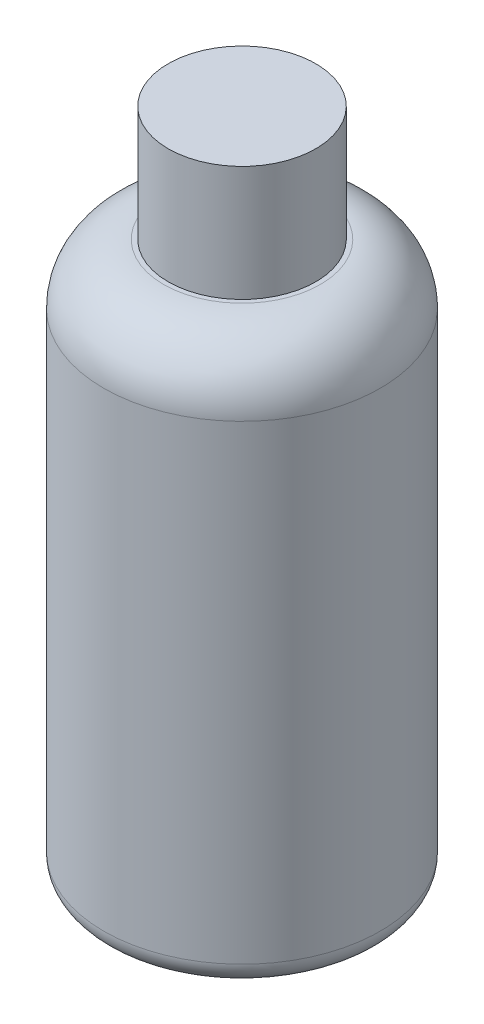
ISO-10303-21;
HEADER;
FILE_DESCRIPTION(('STEP AP214'),'2;1');
FILE_NAME('part.step','',(''),(''),'','','');
FILE_SCHEMA(('AUTOMOTIVE_DESIGN { 1 0 10303 214 1 1 1 1 }'));
ENDSEC;
DATA;
#1=APPLICATION_CONTEXT('core data for automotive mechanical design processes');
#2=APPLICATION_PROTOCOL_DEFINITION('international standard','automotive_design',2000,#1);
#3=PRODUCT_CONTEXT('',#1,'mechanical');
#4=PRODUCT('Part','Part','',(#3));
#5=PRODUCT_RELATED_PRODUCT_CATEGORY('part','',(#4));
#6=PRODUCT_DEFINITION_FORMATION('','',#4);
#7=PRODUCT_DEFINITION_CONTEXT('part definition',#1,'design');
#8=PRODUCT_DEFINITION('design','',#6,#7);
#9=PRODUCT_DEFINITION_SHAPE('','',#8);
#10=(LENGTH_UNIT() NAMED_UNIT(*) SI_UNIT(.MILLI.,.METRE.));
#11=(NAMED_UNIT(*) PLANE_ANGLE_UNIT() SI_UNIT($,.RADIAN.));
#12=(NAMED_UNIT(*) SI_UNIT($,.STERADIAN.) SOLID_ANGLE_UNIT());
#13=UNCERTAINTY_MEASURE_WITH_UNIT(LENGTH_MEASURE(1.E-05),#10,'distance_accuracy_value','');
#14=(GEOMETRIC_REPRESENTATION_CONTEXT(3) GLOBAL_UNCERTAINTY_ASSIGNED_CONTEXT((#13)) GLOBAL_UNIT_ASSIGNED_CONTEXT((#10,
#11,#12)) REPRESENTATION_CONTEXT('',''));
#15=CARTESIAN_POINT('',(0.,0.,0.));
#16=DIRECTION('',(0.,0.,1.));
#17=DIRECTION('',(1.,0.,0.));
#18=AXIS2_PLACEMENT_3D('',#15,#16,#17);
#19=CARTESIAN_POINT('',(0.,120.,17.));
#20=DIRECTION('',(0.,1.,0.));
#21=DIRECTION('',(0.,0.,1.));
#22=AXIS2_PLACEMENT_3D('',#19,#20,#21);
#23=PLANE('',#22);
#24=CARTESIAN_POINT('',(0.,120.,0.));
#25=DIRECTION('',(0.,1.,0.));
#26=DIRECTION('',(0.,0.,1.));
#27=AXIS2_PLACEMENT_3D('',#24,#25,#26);
#28=CIRCLE('',#27,15.);
#29=CARTESIAN_POINT('',(0.,120.,15.));
#30=VERTEX_POINT('',#29);
#31=EDGE_CURVE('E69',#30,#30,#28,.T.);
#32=ORIENTED_EDGE('',*,*,#31,.F.);
#33=EDGE_LOOP('',(#32));
#34=FACE_BOUND('',#33,.T.);
#35=CARTESIAN_POINT('',(0.,120.,0.));
#36=DIRECTION('',(0.,1.,0.));
#37=DIRECTION('',(0.,0.,1.));
#38=AXIS2_PLACEMENT_3D('',#35,#36,#37);
#39=CIRCLE('',#38,17.);
#40=CARTESIAN_POINT('',(0.,120.,17.));
#41=VERTEX_POINT('',#40);
#42=EDGE_CURVE('E77',#41,#41,#39,.T.);
#43=ORIENTED_EDGE('',*,*,#42,.T.);
#44=EDGE_LOOP('',(#43));
#45=FACE_BOUND('',#44,.T.);
#46=ADVANCED_FACE('F48',(#34,#45),#23,.T.);
#47=CARTESIAN_POINT('',(0.,0.,0.));
#48=DIRECTION('',(0.,1.,0.));
#49=DIRECTION('',(0.,0.,1.));
#50=AXIS2_PLACEMENT_3D('',#47,#48,#49);
#51=PLANE('',#50);
#52=CARTESIAN_POINT('',(0.,0.,0.));
#53=DIRECTION('',(0.,1.,0.));
#54=DIRECTION('',(0.,0.,1.));
#55=AXIS2_PLACEMENT_3D('',#52,#53,#54);
#56=CIRCLE('',#55,25.);
#57=CARTESIAN_POINT('',(0.,0.,25.));
#58=VERTEX_POINT('',#57);
#59=EDGE_CURVE('E59',#58,#58,#56,.F.);
#60=ORIENTED_EDGE('',*,*,#59,.T.);
#61=EDGE_LOOP('',(#60));
#62=FACE_BOUND('',#61,.T.);
#63=ADVANCED_FACE('F97',(#62),#51,.F.);
#64=CARTESIAN_POINT('',(0.,120.,0.));
#65=DIRECTION('',(0.,-1.,0.));
#66=DIRECTION('',(0.,0.,-1.));
#67=AXIS2_PLACEMENT_3D('',#64,#65,#66);
#68=CYLINDRICAL_SURFACE('',#67,30.);
#69=CARTESIAN_POINT('',(0.,5.,0.));
#70=DIRECTION('',(0.,1.,0.));
#71=DIRECTION('',(0.,0.,1.));
#72=AXIS2_PLACEMENT_3D('',#69,#70,#71);
#73=CIRCLE('',#72,30.);
#74=CARTESIAN_POINT('',(0.,5.,30.));
#75=VERTEX_POINT('',#74);
#76=EDGE_CURVE('E63',#75,#75,#73,.T.);
#77=ORIENTED_EDGE('',*,*,#76,.T.);
#78=EDGE_LOOP('',(#77));
#79=FACE_BOUND('',#78,.T.);
#80=CARTESIAN_POINT('',(0.,107.,0.));
#81=DIRECTION('',(0.,1.,0.));
#82=DIRECTION('',(0.,0.,1.));
#83=AXIS2_PLACEMENT_3D('',#80,#81,#82);
#84=CIRCLE('',#83,30.);
#85=CARTESIAN_POINT('',(0.,107.,30.));
#86=VERTEX_POINT('',#85);
#87=EDGE_CURVE('E72',#86,#86,#84,.F.);
#88=ORIENTED_EDGE('',*,*,#87,.T.);
#89=EDGE_LOOP('',(#88));
#90=FACE_BOUND('',#89,.T.);
#91=ADVANCED_FACE('F87',(#79,#90),#68,.T.);
#92=CARTESIAN_POINT('',(0.,107.,0.));
#93=DIRECTION('',(0.,1.,0.));
#94=DIRECTION('',(0.,0.,1.));
#95=AXIS2_PLACEMENT_3D('',#92,#93,#94);
#96=TOROIDAL_SURFACE('',#95,17.,13.);
#97=ORIENTED_EDGE('',*,*,#87,.F.);
#98=EDGE_LOOP('',(#97));
#99=FACE_BOUND('',#98,.T.);
#100=ORIENTED_EDGE('',*,*,#42,.F.);
#101=EDGE_LOOP('',(#100));
#102=FACE_BOUND('',#101,.T.);
#103=ADVANCED_FACE('F89',(#99,#102),#96,.T.);
#104=CARTESIAN_POINT('',(0.,1.,0.));
#105=DIRECTION('',(0.,-1.,0.));
#106=DIRECTION('',(0.,0.,-1.));
#107=AXIS2_PLACEMENT_3D('',#104,#105,#106);
#108=PLANE('',#107);
#109=CARTESIAN_POINT('',(0.,1.,0.));
#110=DIRECTION('',(0.,-1.,0.));
#111=DIRECTION('',(0.,0.,-1.));
#112=AXIS2_PLACEMENT_3D('',#109,#110,#111);
#113=CIRCLE('',#112,24.);
#114=CARTESIAN_POINT('',(0.,1.,-24.));
#115=VERTEX_POINT('',#114);
#116=EDGE_CURVE('E12',#115,#115,#113,.F.);
#117=ORIENTED_EDGE('',*,*,#116,.T.);
#118=EDGE_LOOP('',(#117));
#119=FACE_BOUND('',#118,.T.);
#120=ADVANCED_FACE('F92',(#119),#108,.F.);
#121=CARTESIAN_POINT('',(0.,120.,0.));
#122=DIRECTION('',(0.,-1.,0.));
#123=DIRECTION('',(0.,0.,-1.));
#124=AXIS2_PLACEMENT_3D('',#121,#122,#123);
#125=CYLINDRICAL_SURFACE('',#124,29.);
#126=CARTESIAN_POINT('',(0.,6.00000000000001,0.));
#127=DIRECTION('',(0.,-1.,0.));
#128=DIRECTION('',(0.,0.,-1.));
#129=AXIS2_PLACEMENT_3D('',#126,#127,#128);
#130=CIRCLE('',#129,29.);
#131=CARTESIAN_POINT('',(0.,6.00000000000001,-29.));
#132=VERTEX_POINT('',#131);
#133=EDGE_CURVE('E55',#132,#132,#130,.T.);
#134=ORIENTED_EDGE('',*,*,#133,.T.);
#135=EDGE_LOOP('',(#134));
#136=FACE_BOUND('',#135,.T.);
#137=CARTESIAN_POINT('',(0.,107.,0.));
#138=DIRECTION('',(0.,-1.,0.));
#139=DIRECTION('',(0.,0.,-1.));
#140=AXIS2_PLACEMENT_3D('',#137,#138,#139);
#141=CIRCLE('',#140,29.);
#142=CARTESIAN_POINT('',(0.,107.,-29.));
#143=VERTEX_POINT('',#142);
#144=EDGE_CURVE('E73',#143,#143,#141,.T.);
#145=ORIENTED_EDGE('',*,*,#144,.F.);
#146=EDGE_LOOP('',(#145));
#147=FACE_BOUND('',#146,.T.);
#148=ADVANCED_FACE('F127',(#136,#147),#125,.F.);
#149=CARTESIAN_POINT('',(0.,107.,0.));
#150=DIRECTION('',(0.,1.,0.));
#151=DIRECTION('',(0.,0.,1.));
#152=AXIS2_PLACEMENT_3D('',#149,#150,#151);
#153=TOROIDAL_SURFACE('',#152,17.,12.);
#154=ORIENTED_EDGE('',*,*,#144,.T.);
#155=EDGE_LOOP('',(#154));
#156=FACE_BOUND('',#155,.T.);
#157=CARTESIAN_POINT('',(0.,119.,0.));
#158=DIRECTION('',(0.,1.,0.));
#159=DIRECTION('',(0.,0.,1.));
#160=AXIS2_PLACEMENT_3D('',#157,#158,#159);
#161=CIRCLE('',#160,17.);
#162=CARTESIAN_POINT('',(0.,119.,17.));
#163=VERTEX_POINT('',#162);
#164=EDGE_CURVE('E76',#163,#163,#161,.T.);
#165=ORIENTED_EDGE('',*,*,#164,.T.);
#166=EDGE_LOOP('',(#165));
#167=FACE_BOUND('',#166,.T.);
#168=ADVANCED_FACE('F118',(#156,#167),#153,.F.);
#169=CARTESIAN_POINT('',(0.,119.,0.));
#170=DIRECTION('',(0.,1.,0.));
#171=DIRECTION('',(0.,0.,1.));
#172=AXIS2_PLACEMENT_3D('',#169,#170,#171);
#173=PLANE('',#172);
#174=ORIENTED_EDGE('',*,*,#164,.F.);
#175=EDGE_LOOP('',(#174));
#176=FACE_BOUND('',#175,.T.);
#177=CARTESIAN_POINT('',(0.,119.,0.));
#178=DIRECTION('',(0.,1.,0.));
#179=DIRECTION('',(0.,0.,1.));
#180=AXIS2_PLACEMENT_3D('',#177,#178,#179);
#181=CIRCLE('',#180,15.);
#182=CARTESIAN_POINT('',(0.,119.,15.));
#183=VERTEX_POINT('',#182);
#184=EDGE_CURVE('E68',#183,#183,#181,.T.);
#185=ORIENTED_EDGE('',*,*,#184,.T.);
#186=EDGE_LOOP('',(#185));
#187=FACE_BOUND('',#186,.T.);
#188=ADVANCED_FACE('F113',(#176,#187),#173,.F.);
#189=CARTESIAN_POINT('',(0.,145.,0.));
#190=DIRECTION('',(0.,-1.,0.));
#191=DIRECTION('',(0.,0.,-1.));
#192=AXIS2_PLACEMENT_3D('',#189,#190,#191);
#193=CYLINDRICAL_SURFACE('',#192,15.);
#194=ORIENTED_EDGE('',*,*,#184,.F.);
#195=EDGE_LOOP('',(#194));
#196=FACE_BOUND('',#195,.T.);
#197=ORIENTED_EDGE('',*,*,#31,.T.);
#198=EDGE_LOOP('',(#197));
#199=FACE_BOUND('',#198,.T.);
#200=ADVANCED_FACE('F101',(#196,#199),#193,.F.);
#201=CARTESIAN_POINT('',(0.,5.,0.));
#202=DIRECTION('',(0.,1.,0.));
#203=DIRECTION('',(0.,0.,1.));
#204=AXIS2_PLACEMENT_3D('',#201,#202,#203);
#205=TOROIDAL_SURFACE('',#204,25.,5.);
#206=ORIENTED_EDGE('',*,*,#59,.F.);
#207=EDGE_LOOP('',(#206));
#208=FACE_BOUND('',#207,.T.);
#209=ORIENTED_EDGE('',*,*,#76,.F.);
#210=EDGE_LOOP('',(#209));
#211=FACE_BOUND('',#210,.T.);
#212=ADVANCED_FACE('F100',(#208,#211),#205,.T.);
#213=CARTESIAN_POINT('',(0.,6.00000000000001,0.));
#214=DIRECTION('',(0.,-1.,0.));
#215=DIRECTION('',(0.,0.,-1.));
#216=AXIS2_PLACEMENT_3D('',#213,#214,#215);
#217=TOROIDAL_SURFACE('',#216,24.,5.);
#218=ORIENTED_EDGE('',*,*,#116,.F.);
#219=EDGE_LOOP('',(#218));
#220=FACE_BOUND('',#219,.T.);
#221=ORIENTED_EDGE('',*,*,#133,.F.);
#222=EDGE_LOOP('',(#221));
#223=FACE_BOUND('',#222,.T.);
#224=ADVANCED_FACE('F50',(#220,#223),#217,.F.);
#225=CLOSED_SHELL('',(#46,#63,#91,#103,#120,#148,#168,#188,#200,#212,#224));
#226=MANIFOLD_SOLID_BREP('B2',#225);
#227=CARTESIAN_POINT('',(0.,120.,17.));
#228=DIRECTION('',(0.,1.,0.));
#229=DIRECTION('',(0.,0.,1.));
#230=AXIS2_PLACEMENT_3D('',#227,#228,#229);
#231=PLANE('',#230);
#232=CARTESIAN_POINT('',(0.,120.,0.));
#233=DIRECTION('',(0.,1.,0.));
#234=DIRECTION('',(0.,0.,1.));
#235=AXIS2_PLACEMENT_3D('',#232,#233,#234);
#236=CIRCLE('',#235,15.);
#237=CARTESIAN_POINT('',(0.,120.,15.));
#238=VERTEX_POINT('',#237);
#239=EDGE_CURVE('E47',#238,#238,#236,.T.);
#240=ORIENTED_EDGE('',*,*,#239,.T.);
#241=EDGE_LOOP('',(#240));
#242=FACE_BOUND('',#241,.T.);
#243=CARTESIAN_POINT('',(0.,120.,0.));
#244=DIRECTION('',(0.,1.,0.));
#245=DIRECTION('',(0.,0.,1.));
#246=AXIS2_PLACEMENT_3D('',#243,#244,#245);
#247=CIRCLE('',#246,16.);
#248=CARTESIAN_POINT('',(0.,120.,16.));
#249=VERTEX_POINT('',#248);
#250=EDGE_CURVE('E221',#249,#249,#247,.T.);
#251=ORIENTED_EDGE('',*,*,#250,.F.);
#252=EDGE_LOOP('',(#251));
#253=FACE_BOUND('',#252,.T.);
#254=ADVANCED_FACE('F215',(#242,#253),#231,.F.);
#255=CARTESIAN_POINT('',(0.,144.,0.));
#256=DIRECTION('',(0.,1.,0.));
#257=DIRECTION('',(0.,0.,1.));
#258=AXIS2_PLACEMENT_3D('',#255,#256,#257);
#259=PLANE('',#258);
#260=CARTESIAN_POINT('',(0.,144.,0.));
#261=DIRECTION('',(0.,1.,0.));
#262=DIRECTION('',(0.,0.,1.));
#263=AXIS2_PLACEMENT_3D('',#260,#261,#262);
#264=CIRCLE('',#263,15.);
#265=CARTESIAN_POINT('',(0.,144.,15.));
#266=VERTEX_POINT('',#265);
#267=EDGE_CURVE('E229',#266,#266,#264,.T.);
#268=ORIENTED_EDGE('',*,*,#267,.F.);
#269=EDGE_LOOP('',(#268));
#270=FACE_BOUND('',#269,.T.);
#271=ADVANCED_FACE('F237',(#270),#259,.F.);
#272=CARTESIAN_POINT('',(0.,145.,0.));
#273=DIRECTION('',(0.,-1.,0.));
#274=DIRECTION('',(0.,0.,-1.));
#275=AXIS2_PLACEMENT_3D('',#272,#273,#274);
#276=CYLINDRICAL_SURFACE('',#275,15.);
#277=ORIENTED_EDGE('',*,*,#239,.F.);
#278=EDGE_LOOP('',(#277));
#279=FACE_BOUND('',#278,.T.);
#280=ORIENTED_EDGE('',*,*,#267,.T.);
#281=EDGE_LOOP('',(#280));
#282=FACE_BOUND('',#281,.T.);
#283=ADVANCED_FACE('F235',(#279,#282),#276,.F.);
#284=CARTESIAN_POINT('',(0.,145.,0.));
#285=DIRECTION('',(0.,-1.,0.));
#286=DIRECTION('',(0.,0.,-1.));
#287=AXIS2_PLACEMENT_3D('',#284,#285,#286);
#288=CYLINDRICAL_SURFACE('',#287,16.);
#289=CARTESIAN_POINT('',(0.,145.,0.));
#290=DIRECTION('',(0.,1.,0.));
#291=DIRECTION('',(0.,0.,1.));
#292=AXIS2_PLACEMENT_3D('',#289,#290,#291);
#293=CIRCLE('',#292,16.);
#294=CARTESIAN_POINT('',(0.,145.,16.));
#295=VERTEX_POINT('',#294);
#296=EDGE_CURVE('E225',#295,#295,#293,.T.);
#297=ORIENTED_EDGE('',*,*,#296,.F.);
#298=EDGE_LOOP('',(#297));
#299=FACE_BOUND('',#298,.T.);
#300=ORIENTED_EDGE('',*,*,#250,.T.);
#301=EDGE_LOOP('',(#300));
#302=FACE_BOUND('',#301,.T.);
#303=ADVANCED_FACE('F245',(#299,#302),#288,.T.);
#304=CARTESIAN_POINT('',(0.,145.,0.));
#305=DIRECTION('',(0.,1.,0.));
#306=DIRECTION('',(0.,0.,1.));
#307=AXIS2_PLACEMENT_3D('',#304,#305,#306);
#308=PLANE('',#307);
#309=ORIENTED_EDGE('',*,*,#296,.T.);
#310=EDGE_LOOP('',(#309));
#311=FACE_BOUND('',#310,.T.);
#312=ADVANCED_FACE('F240',(#311),#308,.T.);
#313=CLOSED_SHELL('',(#254,#271,#283,#303,#312));
#314=MANIFOLD_SOLID_BREP('B7',#313);
#315=ADVANCED_BREP_SHAPE_REPRESENTATION('',(#18,#226,#314),#14);
#316=SHAPE_DEFINITION_REPRESENTATION(#9,#315);
ENDSEC;
END-ISO-10303-21;
